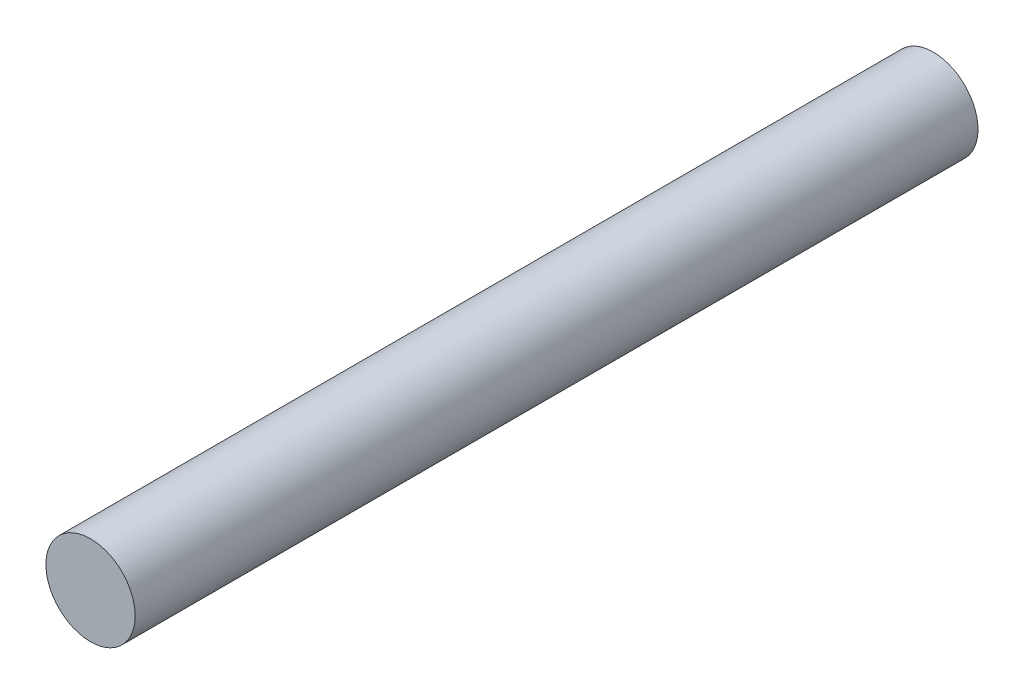
ISO-10303-21;
HEADER;
FILE_DESCRIPTION(('STEP AP214'),'2;1');
FILE_NAME('part.step','',(''),(''),'','','');
FILE_SCHEMA(('AUTOMOTIVE_DESIGN { 1 0 10303 214 1 1 1 1 }'));
ENDSEC;
DATA;
#1=APPLICATION_CONTEXT('core data for automotive mechanical design processes');
#2=APPLICATION_PROTOCOL_DEFINITION('international standard','automotive_design',2000,#1);
#3=PRODUCT_CONTEXT('',#1,'mechanical');
#4=PRODUCT('Part','Part','',(#3));
#5=PRODUCT_RELATED_PRODUCT_CATEGORY('part','',(#4));
#6=PRODUCT_DEFINITION_FORMATION('','',#4);
#7=PRODUCT_DEFINITION_CONTEXT('part definition',#1,'design');
#8=PRODUCT_DEFINITION('design','',#6,#7);
#9=PRODUCT_DEFINITION_SHAPE('','',#8);
#10=(LENGTH_UNIT() NAMED_UNIT(*) SI_UNIT(.MILLI.,.METRE.));
#11=(NAMED_UNIT(*) PLANE_ANGLE_UNIT() SI_UNIT($,.RADIAN.));
#12=(NAMED_UNIT(*) SI_UNIT($,.STERADIAN.) SOLID_ANGLE_UNIT());
#13=UNCERTAINTY_MEASURE_WITH_UNIT(LENGTH_MEASURE(1.E-05),#10,'distance_accuracy_value','');
#14=(GEOMETRIC_REPRESENTATION_CONTEXT(3) GLOBAL_UNCERTAINTY_ASSIGNED_CONTEXT((#13)) GLOBAL_UNIT_ASSIGNED_CONTEXT((#10,
#11,#12)) REPRESENTATION_CONTEXT('',''));
#15=CARTESIAN_POINT('',(0.,0.,0.));
#16=DIRECTION('',(0.,0.,1.));
#17=DIRECTION('',(1.,0.,0.));
#18=AXIS2_PLACEMENT_3D('',#15,#16,#17);
#19=CARTESIAN_POINT('',(0.,0.,89.94775));
#20=DIRECTION('',(0.,0.,-1.));
#21=DIRECTION('',(-1.,0.,0.));
#22=AXIS2_PLACEMENT_3D('',#19,#20,#21);
#23=CYLINDRICAL_SURFACE('',#22,4.7625);
#24=CARTESIAN_POINT('',(0.,0.,89.94775));
#25=DIRECTION('',(0.,0.,1.));
#26=DIRECTION('',(1.,0.,0.));
#27=AXIS2_PLACEMENT_3D('',#24,#25,#26);
#28=CIRCLE('',#27,4.7625);
#29=CARTESIAN_POINT('',(4.7625,0.,89.94775));
#30=VERTEX_POINT('',#29);
#31=EDGE_CURVE('E10',#30,#30,#28,.T.);
#32=ORIENTED_EDGE('',*,*,#31,.F.);
#33=EDGE_LOOP('',(#32));
#34=FACE_BOUND('',#33,.T.);
#35=CARTESIAN_POINT('',(0.,0.,0.));
#36=DIRECTION('',(0.,0.,1.));
#37=DIRECTION('',(1.,0.,0.));
#38=AXIS2_PLACEMENT_3D('',#35,#36,#37);
#39=CIRCLE('',#38,4.7625);
#40=CARTESIAN_POINT('',(4.7625,0.,0.));
#41=VERTEX_POINT('',#40);
#42=EDGE_CURVE('E33',#41,#41,#39,.T.);
#43=ORIENTED_EDGE('',*,*,#42,.T.);
#44=EDGE_LOOP('',(#43));
#45=FACE_BOUND('',#44,.T.);
#46=ADVANCED_FACE('F30',(#34,#45),#23,.T.);
#47=CARTESIAN_POINT('',(0.,0.,89.94775));
#48=DIRECTION('',(0.,0.,1.));
#49=DIRECTION('',(1.,0.,0.));
#50=AXIS2_PLACEMENT_3D('',#47,#48,#49);
#51=PLANE('',#50);
#52=ORIENTED_EDGE('',*,*,#31,.T.);
#53=EDGE_LOOP('',(#52));
#54=FACE_BOUND('',#53,.T.);
#55=ADVANCED_FACE('F45',(#54),#51,.T.);
#56=CARTESIAN_POINT('',(0.,0.,0.));
#57=DIRECTION('',(0.,0.,1.));
#58=DIRECTION('',(1.,0.,0.));
#59=AXIS2_PLACEMENT_3D('',#56,#57,#58);
#60=PLANE('',#59);
#61=ORIENTED_EDGE('',*,*,#42,.F.);
#62=EDGE_LOOP('',(#61));
#63=FACE_BOUND('',#62,.T.);
#64=ADVANCED_FACE('F43',(#63),#60,.F.);
#65=CLOSED_SHELL('',(#46,#55,#64));
#66=MANIFOLD_SOLID_BREP('B2',#65);
#67=ADVANCED_BREP_SHAPE_REPRESENTATION('',(#18,#66),#14);
#68=SHAPE_DEFINITION_REPRESENTATION(#9,#67);
ENDSEC;
END-ISO-10303-21;
